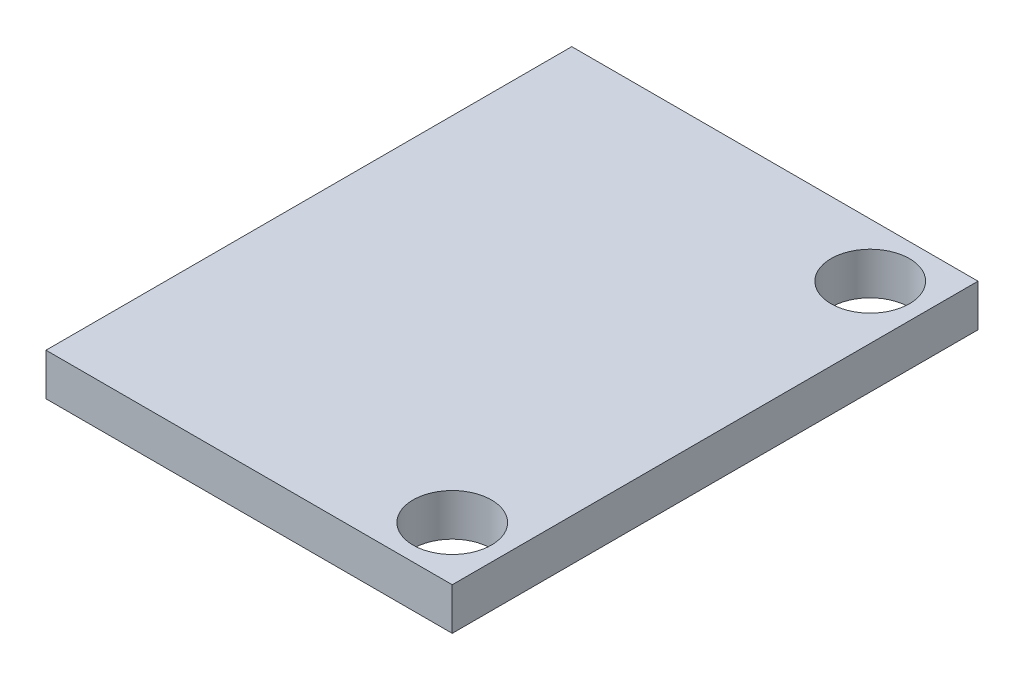
ISO-10303-21;
HEADER;
FILE_DESCRIPTION(('STEP AP214'),'2;1');
FILE_NAME('part.step','',(''),(''),'','','');
FILE_SCHEMA(('AUTOMOTIVE_DESIGN { 1 0 10303 214 1 1 1 1 }'));
ENDSEC;
DATA;
#1=APPLICATION_CONTEXT('core data for automotive mechanical design processes');
#2=APPLICATION_PROTOCOL_DEFINITION('international standard','automotive_design',2000,#1);
#3=PRODUCT_CONTEXT('',#1,'mechanical');
#4=PRODUCT('Part','Part','',(#3));
#5=PRODUCT_RELATED_PRODUCT_CATEGORY('part','',(#4));
#6=PRODUCT_DEFINITION_FORMATION('','',#4);
#7=PRODUCT_DEFINITION_CONTEXT('part definition',#1,'design');
#8=PRODUCT_DEFINITION('design','',#6,#7);
#9=PRODUCT_DEFINITION_SHAPE('','',#8);
#10=(LENGTH_UNIT() NAMED_UNIT(*) SI_UNIT(.MILLI.,.METRE.));
#11=(NAMED_UNIT(*) PLANE_ANGLE_UNIT() SI_UNIT($,.RADIAN.));
#12=(NAMED_UNIT(*) SI_UNIT($,.STERADIAN.) SOLID_ANGLE_UNIT());
#13=UNCERTAINTY_MEASURE_WITH_UNIT(LENGTH_MEASURE(1.E-05),#10,'distance_accuracy_value','');
#14=(GEOMETRIC_REPRESENTATION_CONTEXT(3) GLOBAL_UNCERTAINTY_ASSIGNED_CONTEXT((#13)) GLOBAL_UNIT_ASSIGNED_CONTEXT((#10,
#11,#12)) REPRESENTATION_CONTEXT('',''));
#15=CARTESIAN_POINT('',(0.,0.,0.));
#16=DIRECTION('',(0.,0.,1.));
#17=DIRECTION('',(1.,0.,0.));
#18=AXIS2_PLACEMENT_3D('',#15,#16,#17);
#19=CARTESIAN_POINT('',(7.8994,1.6383,10.2235));
#20=DIRECTION('',(-1.,0.,0.));
#21=DIRECTION('',(0.,0.,1.));
#22=AXIS2_PLACEMENT_3D('',#19,#20,#21);
#23=PLANE('',#22);
#24=DIRECTION('',(0.,0.,-1.));
#25=VECTOR('',#24,1.);
#26=CARTESIAN_POINT('',(7.8994,0.,10.2235));
#27=LINE('',#26,#25);
#28=CARTESIAN_POINT('',(7.8994,0.,10.2235));
#29=VERTEX_POINT('',#28);
#30=CARTESIAN_POINT('',(7.8994,0.,-10.2235));
#31=VERTEX_POINT('',#30);
#32=EDGE_CURVE('E109',#29,#31,#27,.T.);
#33=ORIENTED_EDGE('',*,*,#32,.T.);
#34=DIRECTION('',(0.,-1.,0.));
#35=VECTOR('',#34,1.);
#36=CARTESIAN_POINT('',(7.8994,1.6383,-10.2235));
#37=LINE('',#36,#35);
#38=CARTESIAN_POINT('',(7.8994,1.6383,-10.2235));
#39=VERTEX_POINT('',#38);
#40=EDGE_CURVE('E13',#39,#31,#37,.T.);
#41=ORIENTED_EDGE('',*,*,#40,.F.);
#42=DIRECTION('',(0.,0.,-1.));
#43=VECTOR('',#42,1.);
#44=CARTESIAN_POINT('',(7.8994,1.6383,10.2235));
#45=LINE('',#44,#43);
#46=CARTESIAN_POINT('',(7.8994,1.6383,10.2235));
#47=VERTEX_POINT('',#46);
#48=EDGE_CURVE('E97',#47,#39,#45,.T.);
#49=ORIENTED_EDGE('',*,*,#48,.F.);
#50=DIRECTION('',(0.,-1.,0.));
#51=VECTOR('',#50,1.);
#52=CARTESIAN_POINT('',(7.8994,1.6383,10.2235));
#53=LINE('',#52,#51);
#54=EDGE_CURVE('E105',#47,#29,#53,.T.);
#55=ORIENTED_EDGE('',*,*,#54,.T.);
#56=EDGE_LOOP('',(#33,#41,#49,#55));
#57=FACE_BOUND('',#56,.T.);
#58=ADVANCED_FACE('F46',(#57),#23,.F.);
#59=CARTESIAN_POINT('',(-7.8994,1.6383,-10.2235));
#60=DIRECTION('',(0.,0.,1.));
#61=DIRECTION('',(1.,0.,0.));
#62=AXIS2_PLACEMENT_3D('',#59,#60,#61);
#63=PLANE('',#62);
#64=DIRECTION('',(-1.,0.,0.));
#65=VECTOR('',#64,1.);
#66=CARTESIAN_POINT('',(-7.8994,0.,-10.2235));
#67=LINE('',#66,#65);
#68=CARTESIAN_POINT('',(-7.8994,0.,-10.2235));
#69=VERTEX_POINT('',#68);
#70=EDGE_CURVE('E101',#31,#69,#67,.T.);
#71=ORIENTED_EDGE('',*,*,#70,.T.);
#72=DIRECTION('',(0.,-1.,0.));
#73=VECTOR('',#72,1.);
#74=CARTESIAN_POINT('',(-7.8994,1.6383,-10.2235));
#75=LINE('',#74,#73);
#76=CARTESIAN_POINT('',(-7.8994,1.6383,-10.2235));
#77=VERTEX_POINT('',#76);
#78=EDGE_CURVE('E54',#77,#69,#75,.T.);
#79=ORIENTED_EDGE('',*,*,#78,.F.);
#80=DIRECTION('',(-1.,0.,0.));
#81=VECTOR('',#80,1.);
#82=CARTESIAN_POINT('',(-7.8994,1.6383,-10.2235));
#83=LINE('',#82,#81);
#84=EDGE_CURVE('E92',#39,#77,#83,.T.);
#85=ORIENTED_EDGE('',*,*,#84,.F.);
#86=ORIENTED_EDGE('',*,*,#40,.T.);
#87=EDGE_LOOP('',(#71,#79,#85,#86));
#88=FACE_BOUND('',#87,.T.);
#89=ADVANCED_FACE('F100',(#88),#63,.F.);
#90=CARTESIAN_POINT('',(-7.8994,1.6383,10.2235));
#91=DIRECTION('',(1.,0.,0.));
#92=DIRECTION('',(0.,0.,-1.));
#93=AXIS2_PLACEMENT_3D('',#90,#91,#92);
#94=PLANE('',#93);
#95=DIRECTION('',(0.,0.,1.));
#96=VECTOR('',#95,1.);
#97=CARTESIAN_POINT('',(-7.8994,0.,10.2235));
#98=LINE('',#97,#96);
#99=CARTESIAN_POINT('',(-7.8994,0.,10.2235));
#100=VERTEX_POINT('',#99);
#101=EDGE_CURVE('E79',#69,#100,#98,.T.);
#102=ORIENTED_EDGE('',*,*,#101,.T.);
#103=DIRECTION('',(0.,-1.,0.));
#104=VECTOR('',#103,1.);
#105=CARTESIAN_POINT('',(-7.8994,1.6383,10.2235));
#106=LINE('',#105,#104);
#107=CARTESIAN_POINT('',(-7.8994,1.6383,10.2235));
#108=VERTEX_POINT('',#107);
#109=EDGE_CURVE('E102',#108,#100,#106,.T.);
#110=ORIENTED_EDGE('',*,*,#109,.F.);
#111=DIRECTION('',(0.,0.,1.));
#112=VECTOR('',#111,1.);
#113=CARTESIAN_POINT('',(-7.8994,1.6383,10.2235));
#114=LINE('',#113,#112);
#115=EDGE_CURVE('E95',#77,#108,#114,.T.);
#116=ORIENTED_EDGE('',*,*,#115,.F.);
#117=ORIENTED_EDGE('',*,*,#78,.T.);
#118=EDGE_LOOP('',(#102,#110,#116,#117));
#119=FACE_BOUND('',#118,.T.);
#120=ADVANCED_FACE('F103',(#119),#94,.F.);
#121=CARTESIAN_POINT('',(-7.8994,1.6383,10.2235));
#122=DIRECTION('',(0.,0.,-1.));
#123=DIRECTION('',(-1.,0.,0.));
#124=AXIS2_PLACEMENT_3D('',#121,#122,#123);
#125=PLANE('',#124);
#126=DIRECTION('',(1.,0.,0.));
#127=VECTOR('',#126,1.);
#128=CARTESIAN_POINT('',(-7.8994,0.,10.2235));
#129=LINE('',#128,#127);
#130=EDGE_CURVE('E85',#100,#29,#129,.T.);
#131=ORIENTED_EDGE('',*,*,#130,.T.);
#132=ORIENTED_EDGE('',*,*,#54,.F.);
#133=DIRECTION('',(1.,0.,0.));
#134=VECTOR('',#133,1.);
#135=CARTESIAN_POINT('',(-7.8994,1.6383,10.2235));
#136=LINE('',#135,#134);
#137=EDGE_CURVE('E62',#108,#47,#136,.T.);
#138=ORIENTED_EDGE('',*,*,#137,.F.);
#139=ORIENTED_EDGE('',*,*,#109,.T.);
#140=EDGE_LOOP('',(#131,#132,#138,#139));
#141=FACE_BOUND('',#140,.T.);
#142=ADVANCED_FACE('F117',(#141),#125,.F.);
#143=CARTESIAN_POINT('',(0.,1.6383,0.));
#144=DIRECTION('',(0.,-1.,0.));
#145=DIRECTION('',(0.,0.,-1.));
#146=AXIS2_PLACEMENT_3D('',#143,#144,#145);
#147=PLANE('',#146);
#148=CARTESIAN_POINT('',(5.8039,1.6383,8.128));
#149=DIRECTION('',(0.,1.,0.));
#150=DIRECTION('',(0.,0.,1.));
#151=AXIS2_PLACEMENT_3D('',#148,#149,#150);
#152=CIRCLE('',#151,1.524);
#153=CARTESIAN_POINT('',(5.8039,1.6383,9.652));
#154=VERTEX_POINT('',#153);
#155=EDGE_CURVE('E129',#154,#154,#152,.T.);
#156=ORIENTED_EDGE('',*,*,#155,.F.);
#157=EDGE_LOOP('',(#156));
#158=FACE_BOUND('',#157,.T.);
#159=CARTESIAN_POINT('',(5.8039,1.6383,-8.128));
#160=DIRECTION('',(0.,1.,0.));
#161=DIRECTION('',(0.,0.,-1.));
#162=AXIS2_PLACEMENT_3D('',#159,#160,#161);
#163=CIRCLE('',#162,1.524);
#164=CARTESIAN_POINT('',(5.8039,1.6383,-6.604));
#165=VERTEX_POINT('',#164);
#166=EDGE_CURVE('E123',#165,#165,#163,.T.);
#167=ORIENTED_EDGE('',*,*,#166,.F.);
#168=EDGE_LOOP('',(#167));
#169=FACE_BOUND('',#168,.T.);
#170=ORIENTED_EDGE('',*,*,#48,.T.);
#171=ORIENTED_EDGE('',*,*,#84,.T.);
#172=ORIENTED_EDGE('',*,*,#115,.T.);
#173=ORIENTED_EDGE('',*,*,#137,.T.);
#174=EDGE_LOOP('',(#170,#171,#172,#173));
#175=FACE_BOUND('',#174,.T.);
#176=ADVANCED_FACE('F93',(#158,#169,#175),#147,.F.);
#177=CARTESIAN_POINT('',(0.,0.,0.));
#178=DIRECTION('',(0.,-1.,0.));
#179=DIRECTION('',(0.,0.,-1.));
#180=AXIS2_PLACEMENT_3D('',#177,#178,#179);
#181=PLANE('',#180);
#182=CARTESIAN_POINT('',(5.8039,0.,8.128));
#183=DIRECTION('',(0.,1.,0.));
#184=DIRECTION('',(0.,0.,1.));
#185=AXIS2_PLACEMENT_3D('',#182,#183,#184);
#186=CIRCLE('',#185,1.524);
#187=CARTESIAN_POINT('',(5.8039,0.,9.652));
#188=VERTEX_POINT('',#187);
#189=EDGE_CURVE('E112',#188,#188,#186,.T.);
#190=ORIENTED_EDGE('',*,*,#189,.T.);
#191=EDGE_LOOP('',(#190));
#192=FACE_BOUND('',#191,.T.);
#193=CARTESIAN_POINT('',(5.8039,0.,-8.128));
#194=DIRECTION('',(0.,1.,0.));
#195=DIRECTION('',(0.,0.,-1.));
#196=AXIS2_PLACEMENT_3D('',#193,#194,#195);
#197=CIRCLE('',#196,1.524);
#198=CARTESIAN_POINT('',(5.8039,0.,-6.604));
#199=VERTEX_POINT('',#198);
#200=EDGE_CURVE('E126',#199,#199,#197,.T.);
#201=ORIENTED_EDGE('',*,*,#200,.T.);
#202=EDGE_LOOP('',(#201));
#203=FACE_BOUND('',#202,.T.);
#204=ORIENTED_EDGE('',*,*,#32,.F.);
#205=ORIENTED_EDGE('',*,*,#130,.F.);
#206=ORIENTED_EDGE('',*,*,#101,.F.);
#207=ORIENTED_EDGE('',*,*,#70,.F.);
#208=EDGE_LOOP('',(#204,#205,#206,#207));
#209=FACE_BOUND('',#208,.T.);
#210=ADVANCED_FACE('F120',(#192,#203,#209),#181,.T.);
#211=CARTESIAN_POINT('',(5.8039,0.,-8.128));
#212=DIRECTION('',(0.,1.,0.));
#213=DIRECTION('',(0.,0.,1.));
#214=AXIS2_PLACEMENT_3D('',#211,#212,#213);
#215=CYLINDRICAL_SURFACE('',#214,1.524);
#216=CARTESIAN_POINT('',(5.8039,0.,-6.604));
#217=CARTESIAN_POINT('',(5.8039,0.017065625,-6.604));
#218=CARTESIAN_POINT('',(5.8039,0.03413125,-6.604));
#219=CARTESIAN_POINT('',(5.8039,0.0682625,-6.604));
#220=CARTESIAN_POINT('',(5.8039,0.085328125,-6.604));
#221=CARTESIAN_POINT('',(5.8039,0.119459375,-6.604));
#222=CARTESIAN_POINT('',(5.8039,0.136525,-6.604));
#223=CARTESIAN_POINT('',(5.8039,0.17065625,-6.604));
#224=CARTESIAN_POINT('',(5.8039,0.187721875,-6.604));
#225=CARTESIAN_POINT('',(5.8039,0.221853125,-6.604));
#226=CARTESIAN_POINT('',(5.8039,0.23891875,-6.604));
#227=CARTESIAN_POINT('',(5.8039,0.27305,-6.604));
#228=CARTESIAN_POINT('',(5.8039,0.290115625,-6.604));
#229=CARTESIAN_POINT('',(5.8039,0.324246875,-6.604));
#230=CARTESIAN_POINT('',(5.8039,0.3413125,-6.604));
#231=CARTESIAN_POINT('',(5.8039,0.37544375,-6.604));
#232=CARTESIAN_POINT('',(5.8039,0.392509375,-6.604));
#233=CARTESIAN_POINT('',(5.8039,0.426640625,-6.604));
#234=CARTESIAN_POINT('',(5.8039,0.44370625,-6.604));
#235=CARTESIAN_POINT('',(5.8039,0.4778375,-6.604));
#236=CARTESIAN_POINT('',(5.8039,0.494903125,-6.604));
#237=CARTESIAN_POINT('',(5.8039,0.529034375,-6.604));
#238=CARTESIAN_POINT('',(5.8039,0.5461,-6.604));
#239=CARTESIAN_POINT('',(5.8039,0.58023125,-6.604));
#240=CARTESIAN_POINT('',(5.8039,0.597296875,-6.604));
#241=CARTESIAN_POINT('',(5.8039,0.631428125,-6.604));
#242=CARTESIAN_POINT('',(5.8039,0.64849375,-6.604));
#243=CARTESIAN_POINT('',(5.8039,0.682625,-6.604));
#244=CARTESIAN_POINT('',(5.8039,0.699690625,-6.604));
#245=CARTESIAN_POINT('',(5.8039,0.733821875,-6.604));
#246=CARTESIAN_POINT('',(5.8039,0.7508875,-6.604));
#247=CARTESIAN_POINT('',(5.8039,0.78501875,-6.604));
#248=CARTESIAN_POINT('',(5.8039,0.802084375,-6.604));
#249=CARTESIAN_POINT('',(5.8039,0.836215625,-6.604));
#250=CARTESIAN_POINT('',(5.8039,0.85328125,-6.604));
#251=CARTESIAN_POINT('',(5.8039,0.8874125,-6.604));
#252=CARTESIAN_POINT('',(5.8039,0.904478125,-6.604));
#253=CARTESIAN_POINT('',(5.8039,0.938609375,-6.604));
#254=CARTESIAN_POINT('',(5.8039,0.955675,-6.604));
#255=CARTESIAN_POINT('',(5.8039,0.98980625,-6.604));
#256=CARTESIAN_POINT('',(5.8039,1.006871875,-6.604));
#257=CARTESIAN_POINT('',(5.8039,1.041003125,-6.604));
#258=CARTESIAN_POINT('',(5.8039,1.05806875,-6.604));
#259=CARTESIAN_POINT('',(5.8039,1.0922,-6.604));
#260=CARTESIAN_POINT('',(5.8039,1.109265625,-6.604));
#261=CARTESIAN_POINT('',(5.8039,1.143396875,-6.604));
#262=CARTESIAN_POINT('',(5.8039,1.1604625,-6.604));
#263=CARTESIAN_POINT('',(5.8039,1.19459375,-6.604));
#264=CARTESIAN_POINT('',(5.8039,1.211659375,-6.604));
#265=CARTESIAN_POINT('',(5.8039,1.245790625,-6.604));
#266=CARTESIAN_POINT('',(5.8039,1.26285625,-6.604));
#267=CARTESIAN_POINT('',(5.8039,1.2969875,-6.604));
#268=CARTESIAN_POINT('',(5.8039,1.314053125,-6.604));
#269=CARTESIAN_POINT('',(5.8039,1.348184375,-6.604));
#270=CARTESIAN_POINT('',(5.8039,1.36525,-6.604));
#271=CARTESIAN_POINT('',(5.8039,1.39938125,-6.604));
#272=CARTESIAN_POINT('',(5.8039,1.416446875,-6.604));
#273=CARTESIAN_POINT('',(5.8039,1.450578125,-6.604));
#274=CARTESIAN_POINT('',(5.8039,1.46764375,-6.604));
#275=CARTESIAN_POINT('',(5.8039,1.501775,-6.604));
#276=CARTESIAN_POINT('',(5.8039,1.518840625,-6.604));
#277=CARTESIAN_POINT('',(5.8039,1.552971875,-6.604));
#278=CARTESIAN_POINT('',(5.8039,1.5700375,-6.604));
#279=CARTESIAN_POINT('',(5.8039,1.60416875,-6.604));
#280=CARTESIAN_POINT('',(5.8039,1.621234375,-6.604));
#281=CARTESIAN_POINT('',(5.8039,1.6383,-6.604));
#282=B_SPLINE_CURVE_WITH_KNOTS('',3,(#216,#217,#218,#219,#220,#221,#222,#223,#224,#225,#226,
#227,#228,#229,#230,#231,#232,#233,#234,#235,#236,#237,#238,#239,#240,#241,#242,#243,#244,#245,
#246,#247,#248,#249,#250,#251,#252,#253,#254,#255,#256,#257,#258,#259,#260,#261,#262,#263,#264,
#265,#266,#267,#268,#269,#270,#271,#272,#273,#274,#275,#276,#277,#278,#279,#280,#281),
.UNSPECIFIED.,.F.,.F.,(4,2,2,2,2,2,2,2,2,2,2,2,2,2,2,2,2,2,2,2,2,2,2,2,2,2,2,2,2,2,2,2,4),(0.,
0.051196875,0.10239375,0.153590625,0.2047875,0.255984375,0.30718125,0.358378125,0.409575,
0.460771875,0.51196875,0.563165625,0.6143625,0.665559375,0.71675625,0.767953125,0.81915,
0.870346875,0.92154375,0.972740625,1.0239375,1.075134375,1.12633125,1.177528125,1.228725,
1.279921875,1.33111875,1.382315625,1.4335125,1.484709375,1.53590625,1.587103125,1.6383),.UNSPECIFIED.);
#283=EDGE_CURVE('BSEAM140',#199,#165,#282,.T.);
#284=ORIENTED_EDGE('',*,*,#200,.F.);
#285=ORIENTED_EDGE('',*,*,#166,.T.);
#286=ORIENTED_EDGE('',*,*,#283,.T.);
#287=ORIENTED_EDGE('',*,*,#283,.F.);
#288=EDGE_LOOP('',(#284,#286,#285,#287));
#289=FACE_BOUND('',#288,.T.);
#290=ADVANCED_FACE('F140',(#289),#215,.F.);
#291=CARTESIAN_POINT('',(5.8039,0.,8.128));
#292=DIRECTION('',(0.,1.,0.));
#293=DIRECTION('',(0.,0.,1.));
#294=AXIS2_PLACEMENT_3D('',#291,#292,#293);
#295=CYLINDRICAL_SURFACE('',#294,1.524);
#296=CARTESIAN_POINT('',(5.8039,0.,9.652));
#297=CARTESIAN_POINT('',(5.8039,0.017065625,9.652));
#298=CARTESIAN_POINT('',(5.8039,0.03413125,9.652));
#299=CARTESIAN_POINT('',(5.8039,0.0682625,9.652));
#300=CARTESIAN_POINT('',(5.8039,0.085328125,9.652));
#301=CARTESIAN_POINT('',(5.8039,0.119459375,9.652));
#302=CARTESIAN_POINT('',(5.8039,0.136525,9.652));
#303=CARTESIAN_POINT('',(5.8039,0.17065625,9.652));
#304=CARTESIAN_POINT('',(5.8039,0.187721875,9.652));
#305=CARTESIAN_POINT('',(5.8039,0.221853125,9.652));
#306=CARTESIAN_POINT('',(5.8039,0.23891875,9.652));
#307=CARTESIAN_POINT('',(5.8039,0.27305,9.652));
#308=CARTESIAN_POINT('',(5.8039,0.290115625,9.652));
#309=CARTESIAN_POINT('',(5.8039,0.324246875,9.652));
#310=CARTESIAN_POINT('',(5.8039,0.3413125,9.652));
#311=CARTESIAN_POINT('',(5.8039,0.37544375,9.652));
#312=CARTESIAN_POINT('',(5.8039,0.392509375,9.652));
#313=CARTESIAN_POINT('',(5.8039,0.426640625,9.652));
#314=CARTESIAN_POINT('',(5.8039,0.44370625,9.652));
#315=CARTESIAN_POINT('',(5.8039,0.4778375,9.652));
#316=CARTESIAN_POINT('',(5.8039,0.494903125,9.652));
#317=CARTESIAN_POINT('',(5.8039,0.529034375,9.652));
#318=CARTESIAN_POINT('',(5.8039,0.5461,9.652));
#319=CARTESIAN_POINT('',(5.8039,0.58023125,9.652));
#320=CARTESIAN_POINT('',(5.8039,0.597296875,9.652));
#321=CARTESIAN_POINT('',(5.8039,0.631428125,9.652));
#322=CARTESIAN_POINT('',(5.8039,0.64849375,9.652));
#323=CARTESIAN_POINT('',(5.8039,0.682625,9.652));
#324=CARTESIAN_POINT('',(5.8039,0.699690625,9.652));
#325=CARTESIAN_POINT('',(5.8039,0.733821875,9.652));
#326=CARTESIAN_POINT('',(5.8039,0.7508875,9.652));
#327=CARTESIAN_POINT('',(5.8039,0.78501875,9.652));
#328=CARTESIAN_POINT('',(5.8039,0.802084375,9.652));
#329=CARTESIAN_POINT('',(5.8039,0.836215625,9.652));
#330=CARTESIAN_POINT('',(5.8039,0.85328125,9.652));
#331=CARTESIAN_POINT('',(5.8039,0.8874125,9.652));
#332=CARTESIAN_POINT('',(5.8039,0.904478125,9.652));
#333=CARTESIAN_POINT('',(5.8039,0.938609375,9.652));
#334=CARTESIAN_POINT('',(5.8039,0.955675,9.652));
#335=CARTESIAN_POINT('',(5.8039,0.98980625,9.652));
#336=CARTESIAN_POINT('',(5.8039,1.006871875,9.652));
#337=CARTESIAN_POINT('',(5.8039,1.041003125,9.652));
#338=CARTESIAN_POINT('',(5.8039,1.05806875,9.652));
#339=CARTESIAN_POINT('',(5.8039,1.0922,9.652));
#340=CARTESIAN_POINT('',(5.8039,1.109265625,9.652));
#341=CARTESIAN_POINT('',(5.8039,1.143396875,9.652));
#342=CARTESIAN_POINT('',(5.8039,1.1604625,9.652));
#343=CARTESIAN_POINT('',(5.8039,1.19459375,9.652));
#344=CARTESIAN_POINT('',(5.8039,1.211659375,9.652));
#345=CARTESIAN_POINT('',(5.8039,1.245790625,9.652));
#346=CARTESIAN_POINT('',(5.8039,1.26285625,9.652));
#347=CARTESIAN_POINT('',(5.8039,1.2969875,9.652));
#348=CARTESIAN_POINT('',(5.8039,1.314053125,9.652));
#349=CARTESIAN_POINT('',(5.8039,1.348184375,9.652));
#350=CARTESIAN_POINT('',(5.8039,1.36525,9.652));
#351=CARTESIAN_POINT('',(5.8039,1.39938125,9.652));
#352=CARTESIAN_POINT('',(5.8039,1.416446875,9.652));
#353=CARTESIAN_POINT('',(5.8039,1.450578125,9.652));
#354=CARTESIAN_POINT('',(5.8039,1.46764375,9.652));
#355=CARTESIAN_POINT('',(5.8039,1.501775,9.652));
#356=CARTESIAN_POINT('',(5.8039,1.518840625,9.652));
#357=CARTESIAN_POINT('',(5.8039,1.552971875,9.652));
#358=CARTESIAN_POINT('',(5.8039,1.5700375,9.652));
#359=CARTESIAN_POINT('',(5.8039,1.60416875,9.652));
#360=CARTESIAN_POINT('',(5.8039,1.621234375,9.652));
#361=CARTESIAN_POINT('',(5.8039,1.6383,9.652));
#362=B_SPLINE_CURVE_WITH_KNOTS('',3,(#296,#297,#298,#299,#300,#301,#302,#303,#304,#305,#306,
#307,#308,#309,#310,#311,#312,#313,#314,#315,#316,#317,#318,#319,#320,#321,#322,#323,#324,#325,
#326,#327,#328,#329,#330,#331,#332,#333,#334,#335,#336,#337,#338,#339,#340,#341,#342,#343,#344,
#345,#346,#347,#348,#349,#350,#351,#352,#353,#354,#355,#356,#357,#358,#359,#360,#361),
.UNSPECIFIED.,.F.,.F.,(4,2,2,2,2,2,2,2,2,2,2,2,2,2,2,2,2,2,2,2,2,2,2,2,2,2,2,2,2,2,2,2,4),(0.,
0.051196875,0.10239375,0.153590625,0.2047875,0.255984375,0.30718125,0.358378125,0.409575,
0.460771875,0.51196875,0.563165625,0.6143625,0.665559375,0.71675625,0.767953125,0.81915,
0.870346875,0.92154375,0.972740625,1.0239375,1.075134375,1.12633125,1.177528125,1.228725,
1.279921875,1.33111875,1.382315625,1.4335125,1.484709375,1.53590625,1.587103125,1.6383),.UNSPECIFIED.);
#363=EDGE_CURVE('BSEAM137',#188,#154,#362,.T.);
#364=ORIENTED_EDGE('',*,*,#189,.F.);
#365=ORIENTED_EDGE('',*,*,#155,.T.);
#366=ORIENTED_EDGE('',*,*,#363,.T.);
#367=ORIENTED_EDGE('',*,*,#363,.F.);
#368=EDGE_LOOP('',(#364,#366,#365,#367));
#369=FACE_BOUND('',#368,.T.);
#370=ADVANCED_FACE('F137',(#369),#295,.F.);
#371=CLOSED_SHELL('',(#58,#89,#120,#142,#176,#210,#290,#370));
#372=MANIFOLD_SOLID_BREP('B2',#371);
#373=ADVANCED_BREP_SHAPE_REPRESENTATION('',(#18,#372),#14);
#374=SHAPE_DEFINITION_REPRESENTATION(#9,#373);
ENDSEC;
END-ISO-10303-21;
